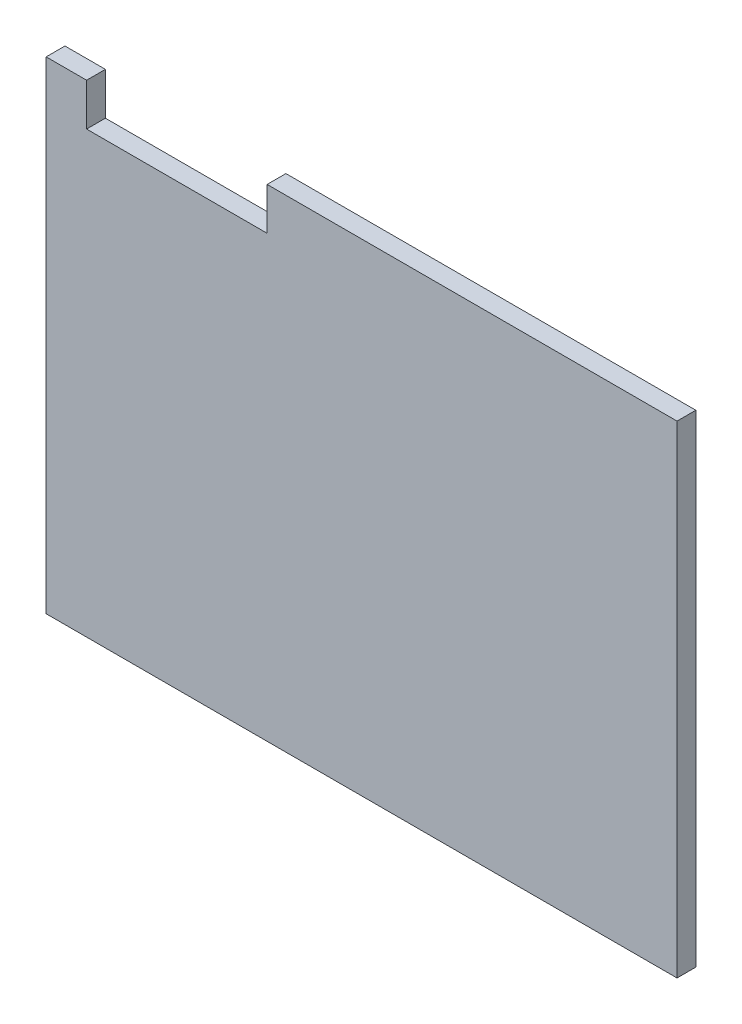
ISO-10303-21;
HEADER;
FILE_DESCRIPTION(('STEP AP214'),'2;1');
FILE_NAME('part.step','',(''),(''),'','','');
FILE_SCHEMA(('AUTOMOTIVE_DESIGN { 1 0 10303 214 1 1 1 1 }'));
ENDSEC;
DATA;
#1=APPLICATION_CONTEXT('core data for automotive mechanical design processes');
#2=APPLICATION_PROTOCOL_DEFINITION('international standard','automotive_design',2000,#1);
#3=PRODUCT_CONTEXT('',#1,'mechanical');
#4=PRODUCT('Part','Part','',(#3));
#5=PRODUCT_RELATED_PRODUCT_CATEGORY('part','',(#4));
#6=PRODUCT_DEFINITION_FORMATION('','',#4);
#7=PRODUCT_DEFINITION_CONTEXT('part definition',#1,'design');
#8=PRODUCT_DEFINITION('design','',#6,#7);
#9=PRODUCT_DEFINITION_SHAPE('','',#8);
#10=(LENGTH_UNIT() NAMED_UNIT(*) SI_UNIT(.MILLI.,.METRE.));
#11=(NAMED_UNIT(*) PLANE_ANGLE_UNIT() SI_UNIT($,.RADIAN.));
#12=(NAMED_UNIT(*) SI_UNIT($,.STERADIAN.) SOLID_ANGLE_UNIT());
#13=UNCERTAINTY_MEASURE_WITH_UNIT(LENGTH_MEASURE(1.E-05),#10,'distance_accuracy_value','');
#14=(GEOMETRIC_REPRESENTATION_CONTEXT(3) GLOBAL_UNCERTAINTY_ASSIGNED_CONTEXT((#13)) GLOBAL_UNIT_ASSIGNED_CONTEXT((#10,
#11,#12)) REPRESENTATION_CONTEXT('',''));
#15=CARTESIAN_POINT('',(0.,0.,0.));
#16=DIRECTION('',(0.,0.,1.));
#17=DIRECTION('',(1.,0.,0.));
#18=AXIS2_PLACEMENT_3D('',#15,#16,#17);
#19=CARTESIAN_POINT('',(0.,0.,0.));
#20=DIRECTION('',(0.,0.,1.));
#21=DIRECTION('',(1.,0.,0.));
#22=AXIS2_PLACEMENT_3D('',#19,#20,#21);
#23=PLANE('',#22);
#24=DIRECTION('',(-1.,0.,0.));
#25=VECTOR('',#24,1.);
#26=CARTESIAN_POINT('',(0.,-2.09999999999999,0.));
#27=LINE('',#26,#25);
#28=CARTESIAN_POINT('',(-89.1457314106681,-2.10000000000001,0.));
#29=VERTEX_POINT('',#28);
#30=CARTESIAN_POINT('',(-93.4457314106681,-2.10000000000001,0.));
#31=VERTEX_POINT('',#30);
#32=EDGE_CURVE('E112',#29,#31,#27,.T.);
#33=ORIENTED_EDGE('',*,*,#32,.F.);
#34=DIRECTION('',(0.,1.,0.));
#35=VECTOR('',#34,1.);
#36=CARTESIAN_POINT('',(-89.1457314106681,0.,0.));
#37=LINE('',#36,#35);
#38=CARTESIAN_POINT('',(-89.1457314106681,-6.6,0.));
#39=VERTEX_POINT('',#38);
#40=EDGE_CURVE('E134',#39,#29,#37,.T.);
#41=ORIENTED_EDGE('',*,*,#40,.F.);
#42=DIRECTION('',(-1.,0.,0.));
#43=VECTOR('',#42,1.);
#44=CARTESIAN_POINT('',(0.,-6.59999999999999,0.));
#45=LINE('',#44,#43);
#46=CARTESIAN_POINT('',(-69.945731410668,-6.6,0.));
#47=VERTEX_POINT('',#46);
#48=EDGE_CURVE('E136',#47,#39,#45,.T.);
#49=ORIENTED_EDGE('',*,*,#48,.F.);
#50=DIRECTION('',(0.,-1.,0.));
#51=VECTOR('',#50,1.);
#52=CARTESIAN_POINT('',(-69.945731410668,0.,0.));
#53=LINE('',#52,#51);
#54=CARTESIAN_POINT('',(-69.945731410668,-2.10000000000001,0.));
#55=VERTEX_POINT('',#54);
#56=EDGE_CURVE('E138',#55,#47,#53,.T.);
#57=ORIENTED_EDGE('',*,*,#56,.F.);
#58=DIRECTION('',(-1.,0.,0.));
#59=VECTOR('',#58,1.);
#60=CARTESIAN_POINT('',(0.,-2.1,0.));
#61=LINE('',#60,#59);
#62=CARTESIAN_POINT('',(-26.3457314106681,-2.1,0.));
#63=VERTEX_POINT('',#62);
#64=EDGE_CURVE('E140',#63,#55,#61,.T.);
#65=ORIENTED_EDGE('',*,*,#64,.F.);
#66=DIRECTION('',(0.,1.,0.));
#67=VECTOR('',#66,1.);
#68=CARTESIAN_POINT('',(-26.3457314106681,0.,0.));
#69=LINE('',#68,#67);
#70=CARTESIAN_POINT('',(-26.3457314106681,-53.4,0.));
#71=VERTEX_POINT('',#70);
#72=EDGE_CURVE('E142',#71,#63,#69,.T.);
#73=ORIENTED_EDGE('',*,*,#72,.F.);
#74=DIRECTION('',(-1.,0.,0.));
#75=VECTOR('',#74,1.);
#76=CARTESIAN_POINT('',(-93.4457314106681,-53.4,0.));
#77=LINE('',#76,#75);
#78=CARTESIAN_POINT('',(-93.4457314106681,-53.4,0.));
#79=VERTEX_POINT('',#78);
#80=EDGE_CURVE('E130',#71,#79,#77,.T.);
#81=ORIENTED_EDGE('',*,*,#80,.T.);
#82=DIRECTION('',(0.,-1.,0.));
#83=VECTOR('',#82,1.);
#84=CARTESIAN_POINT('',(-93.4457314106681,0.,0.));
#85=LINE('',#84,#83);
#86=EDGE_CURVE('E119',#31,#79,#85,.T.);
#87=ORIENTED_EDGE('',*,*,#86,.F.);
#88=EDGE_LOOP('',(#33,#41,#49,#57,#65,#73,#81,#87));
#89=FACE_BOUND('',#88,.T.);
#90=ADVANCED_FACE('F37',(#89),#23,.F.);
#91=CARTESIAN_POINT('',(0.,-2.09999999999999,0.));
#92=DIRECTION('',(0.,1.,0.));
#93=DIRECTION('',(-1.,0.,0.));
#94=AXIS2_PLACEMENT_3D('',#91,#92,#93);
#95=PLANE('',#94);
#96=DIRECTION('',(-1.,0.,0.));
#97=VECTOR('',#96,1.);
#98=CARTESIAN_POINT('',(0.,-2.09999999999999,2.));
#99=LINE('',#98,#97);
#100=CARTESIAN_POINT('',(-89.1457314106681,-2.10000000000001,2.));
#101=VERTEX_POINT('',#100);
#102=CARTESIAN_POINT('',(-93.4457314106681,-2.10000000000001,2.));
#103=VERTEX_POINT('',#102);
#104=EDGE_CURVE('E52',#101,#103,#99,.T.);
#105=ORIENTED_EDGE('',*,*,#104,.F.);
#106=DIRECTION('',(0.,0.,1.));
#107=VECTOR('',#106,1.);
#108=CARTESIAN_POINT('',(-89.1457314106681,-2.10000000000001,0.));
#109=LINE('',#108,#107);
#110=EDGE_CURVE('E40',#29,#101,#109,.T.);
#111=ORIENTED_EDGE('',*,*,#110,.F.);
#112=ORIENTED_EDGE('',*,*,#32,.T.);
#113=DIRECTION('',(0.,0.,1.));
#114=VECTOR('',#113,1.);
#115=CARTESIAN_POINT('',(-93.4457314106681,-2.10000000000001,0.));
#116=LINE('',#115,#114);
#117=EDGE_CURVE('E11',#31,#103,#116,.T.);
#118=ORIENTED_EDGE('',*,*,#117,.T.);
#119=EDGE_LOOP('',(#105,#111,#112,#118));
#120=FACE_BOUND('',#119,.T.);
#121=ADVANCED_FACE('F175',(#120),#95,.T.);
#122=CARTESIAN_POINT('',(-93.4457314106681,0.,0.));
#123=DIRECTION('',(-1.,0.,0.));
#124=DIRECTION('',(0.,0.,1.));
#125=AXIS2_PLACEMENT_3D('',#122,#123,#124);
#126=PLANE('',#125);
#127=DIRECTION('',(0.,-1.,0.));
#128=VECTOR('',#127,1.);
#129=CARTESIAN_POINT('',(-93.4457314106681,0.,2.));
#130=LINE('',#129,#128);
#131=CARTESIAN_POINT('',(-93.4457314106681,-53.4,2.));
#132=VERTEX_POINT('',#131);
#133=EDGE_CURVE('E103',#103,#132,#130,.T.);
#134=ORIENTED_EDGE('',*,*,#133,.F.);
#135=ORIENTED_EDGE('',*,*,#117,.F.);
#136=ORIENTED_EDGE('',*,*,#86,.T.);
#137=DIRECTION('',(0.,0.,1.));
#138=VECTOR('',#137,1.);
#139=CARTESIAN_POINT('',(-93.4457314106681,-53.4,-67.7008862571237));
#140=LINE('',#139,#138);
#141=EDGE_CURVE('E116',#79,#132,#140,.T.);
#142=ORIENTED_EDGE('',*,*,#141,.T.);
#143=EDGE_LOOP('',(#134,#135,#136,#142));
#144=FACE_BOUND('',#143,.T.);
#145=ADVANCED_FACE('F117',(#144),#126,.T.);
#146=CARTESIAN_POINT('',(-26.3457314106681,0.,0.));
#147=DIRECTION('',(1.,0.,0.));
#148=DIRECTION('',(0.,0.,-1.));
#149=AXIS2_PLACEMENT_3D('',#146,#147,#148);
#150=PLANE('',#149);
#151=DIRECTION('',(0.,1.,0.));
#152=VECTOR('',#151,1.);
#153=CARTESIAN_POINT('',(-26.3457314106681,0.,2.));
#154=LINE('',#153,#152);
#155=CARTESIAN_POINT('',(-26.3457314106681,-53.4,2.));
#156=VERTEX_POINT('',#155);
#157=CARTESIAN_POINT('',(-26.3457314106681,-2.1,2.));
#158=VERTEX_POINT('',#157);
#159=EDGE_CURVE('E113',#156,#158,#154,.T.);
#160=ORIENTED_EDGE('',*,*,#159,.F.);
#161=DIRECTION('',(0.,0.,1.));
#162=VECTOR('',#161,1.);
#163=CARTESIAN_POINT('',(-26.3457314106681,-53.4,-67.7008862571237));
#164=LINE('',#163,#162);
#165=EDGE_CURVE('E123',#71,#156,#164,.T.);
#166=ORIENTED_EDGE('',*,*,#165,.F.);
#167=ORIENTED_EDGE('',*,*,#72,.T.);
#168=DIRECTION('',(0.,0.,1.));
#169=VECTOR('',#168,1.);
#170=CARTESIAN_POINT('',(-26.3457314106681,-2.1,0.));
#171=LINE('',#170,#169);
#172=EDGE_CURVE('E45',#63,#158,#171,.T.);
#173=ORIENTED_EDGE('',*,*,#172,.T.);
#174=EDGE_LOOP('',(#160,#166,#167,#173));
#175=FACE_BOUND('',#174,.T.);
#176=ADVANCED_FACE('F182',(#175),#150,.T.);
#177=CARTESIAN_POINT('',(0.,-2.1,0.));
#178=DIRECTION('',(0.,1.,0.));
#179=DIRECTION('',(-1.,0.,0.));
#180=AXIS2_PLACEMENT_3D('',#177,#178,#179);
#181=PLANE('',#180);
#182=DIRECTION('',(-1.,0.,0.));
#183=VECTOR('',#182,1.);
#184=CARTESIAN_POINT('',(0.,-2.1,2.));
#185=LINE('',#184,#183);
#186=CARTESIAN_POINT('',(-69.945731410668,-2.10000000000001,2.));
#187=VERTEX_POINT('',#186);
#188=EDGE_CURVE('E154',#158,#187,#185,.T.);
#189=ORIENTED_EDGE('',*,*,#188,.F.);
#190=ORIENTED_EDGE('',*,*,#172,.F.);
#191=ORIENTED_EDGE('',*,*,#64,.T.);
#192=DIRECTION('',(0.,0.,1.));
#193=VECTOR('',#192,1.);
#194=CARTESIAN_POINT('',(-69.945731410668,-2.10000000000001,0.));
#195=LINE('',#194,#193);
#196=EDGE_CURVE('E159',#55,#187,#195,.T.);
#197=ORIENTED_EDGE('',*,*,#196,.T.);
#198=EDGE_LOOP('',(#189,#190,#191,#197));
#199=FACE_BOUND('',#198,.T.);
#200=ADVANCED_FACE('F201',(#199),#181,.T.);
#201=CARTESIAN_POINT('',(-69.945731410668,0.,0.));
#202=DIRECTION('',(-1.,0.,0.));
#203=DIRECTION('',(0.,0.,1.));
#204=AXIS2_PLACEMENT_3D('',#201,#202,#203);
#205=PLANE('',#204);
#206=DIRECTION('',(0.,-1.,0.));
#207=VECTOR('',#206,1.);
#208=CARTESIAN_POINT('',(-69.945731410668,0.,2.));
#209=LINE('',#208,#207);
#210=CARTESIAN_POINT('',(-69.945731410668,-6.6,2.));
#211=VERTEX_POINT('',#210);
#212=EDGE_CURVE('E151',#187,#211,#209,.T.);
#213=ORIENTED_EDGE('',*,*,#212,.F.);
#214=ORIENTED_EDGE('',*,*,#196,.F.);
#215=ORIENTED_EDGE('',*,*,#56,.T.);
#216=DIRECTION('',(0.,0.,1.));
#217=VECTOR('',#216,1.);
#218=CARTESIAN_POINT('',(-69.945731410668,-6.6,0.));
#219=LINE('',#218,#217);
#220=EDGE_CURVE('E161',#47,#211,#219,.T.);
#221=ORIENTED_EDGE('',*,*,#220,.T.);
#222=EDGE_LOOP('',(#213,#214,#215,#221));
#223=FACE_BOUND('',#222,.T.);
#224=ADVANCED_FACE('F197',(#223),#205,.T.);
#225=CARTESIAN_POINT('',(0.,-6.59999999999999,0.));
#226=DIRECTION('',(0.,1.,0.));
#227=DIRECTION('',(-1.,0.,0.));
#228=AXIS2_PLACEMENT_3D('',#225,#226,#227);
#229=PLANE('',#228);
#230=DIRECTION('',(-1.,0.,0.));
#231=VECTOR('',#230,1.);
#232=CARTESIAN_POINT('',(0.,-6.59999999999999,2.));
#233=LINE('',#232,#231);
#234=CARTESIAN_POINT('',(-89.1457314106681,-6.6,2.));
#235=VERTEX_POINT('',#234);
#236=EDGE_CURVE('E148',#211,#235,#233,.T.);
#237=ORIENTED_EDGE('',*,*,#236,.F.);
#238=ORIENTED_EDGE('',*,*,#220,.F.);
#239=ORIENTED_EDGE('',*,*,#48,.T.);
#240=DIRECTION('',(0.,0.,1.));
#241=VECTOR('',#240,1.);
#242=CARTESIAN_POINT('',(-89.1457314106681,-6.6,0.));
#243=LINE('',#242,#241);
#244=EDGE_CURVE('E60',#39,#235,#243,.T.);
#245=ORIENTED_EDGE('',*,*,#244,.T.);
#246=EDGE_LOOP('',(#237,#238,#239,#245));
#247=FACE_BOUND('',#246,.T.);
#248=ADVANCED_FACE('F169',(#247),#229,.T.);
#249=CARTESIAN_POINT('',(-89.1457314106681,0.,0.));
#250=DIRECTION('',(1.,0.,0.));
#251=DIRECTION('',(0.,0.,-1.));
#252=AXIS2_PLACEMENT_3D('',#249,#250,#251);
#253=PLANE('',#252);
#254=DIRECTION('',(0.,1.,0.));
#255=VECTOR('',#254,1.);
#256=CARTESIAN_POINT('',(-89.1457314106681,0.,2.));
#257=LINE('',#256,#255);
#258=EDGE_CURVE('E146',#235,#101,#257,.T.);
#259=ORIENTED_EDGE('',*,*,#258,.F.);
#260=ORIENTED_EDGE('',*,*,#244,.F.);
#261=ORIENTED_EDGE('',*,*,#40,.T.);
#262=ORIENTED_EDGE('',*,*,#110,.T.);
#263=EDGE_LOOP('',(#259,#260,#261,#262));
#264=FACE_BOUND('',#263,.T.);
#265=ADVANCED_FACE('F164',(#264),#253,.T.);
#266=CARTESIAN_POINT('',(0.,0.,2.));
#267=DIRECTION('',(0.,0.,1.));
#268=DIRECTION('',(1.,0.,0.));
#269=AXIS2_PLACEMENT_3D('',#266,#267,#268);
#270=PLANE('',#269);
#271=ORIENTED_EDGE('',*,*,#258,.T.);
#272=ORIENTED_EDGE('',*,*,#104,.T.);
#273=ORIENTED_EDGE('',*,*,#133,.T.);
#274=DIRECTION('',(1.,0.,0.));
#275=VECTOR('',#274,1.);
#276=CARTESIAN_POINT('',(-93.4457314106681,-53.4,2.));
#277=LINE('',#276,#275);
#278=EDGE_CURVE('E109',#132,#156,#277,.T.);
#279=ORIENTED_EDGE('',*,*,#278,.T.);
#280=ORIENTED_EDGE('',*,*,#159,.T.);
#281=ORIENTED_EDGE('',*,*,#188,.T.);
#282=ORIENTED_EDGE('',*,*,#212,.T.);
#283=ORIENTED_EDGE('',*,*,#236,.T.);
#284=EDGE_LOOP('',(#271,#272,#273,#279,#280,#281,#282,#283));
#285=FACE_BOUND('',#284,.T.);
#286=ADVANCED_FACE('F106',(#285),#270,.T.);
#287=CARTESIAN_POINT('',(-93.4457314106681,-53.4,-67.7008862571237));
#288=DIRECTION('',(0.,-1.,0.));
#289=DIRECTION('',(0.,0.,-1.));
#290=AXIS2_PLACEMENT_3D('',#287,#288,#289);
#291=PLANE('',#290);
#292=ORIENTED_EDGE('',*,*,#80,.F.);
#293=ORIENTED_EDGE('',*,*,#165,.T.);
#294=ORIENTED_EDGE('',*,*,#278,.F.);
#295=ORIENTED_EDGE('',*,*,#141,.F.);
#296=EDGE_LOOP('',(#292,#293,#294,#295));
#297=FACE_BOUND('',#296,.T.);
#298=ADVANCED_FACE('F126',(#297),#291,.T.);
#299=CLOSED_SHELL('',(#90,#121,#145,#176,#200,#224,#248,#265,#286,#298));
#300=MANIFOLD_SOLID_BREP('B2',#299);
#301=ADVANCED_BREP_SHAPE_REPRESENTATION('',(#18,#300),#14);
#302=SHAPE_DEFINITION_REPRESENTATION(#9,#301);
ENDSEC;
END-ISO-10303-21;
